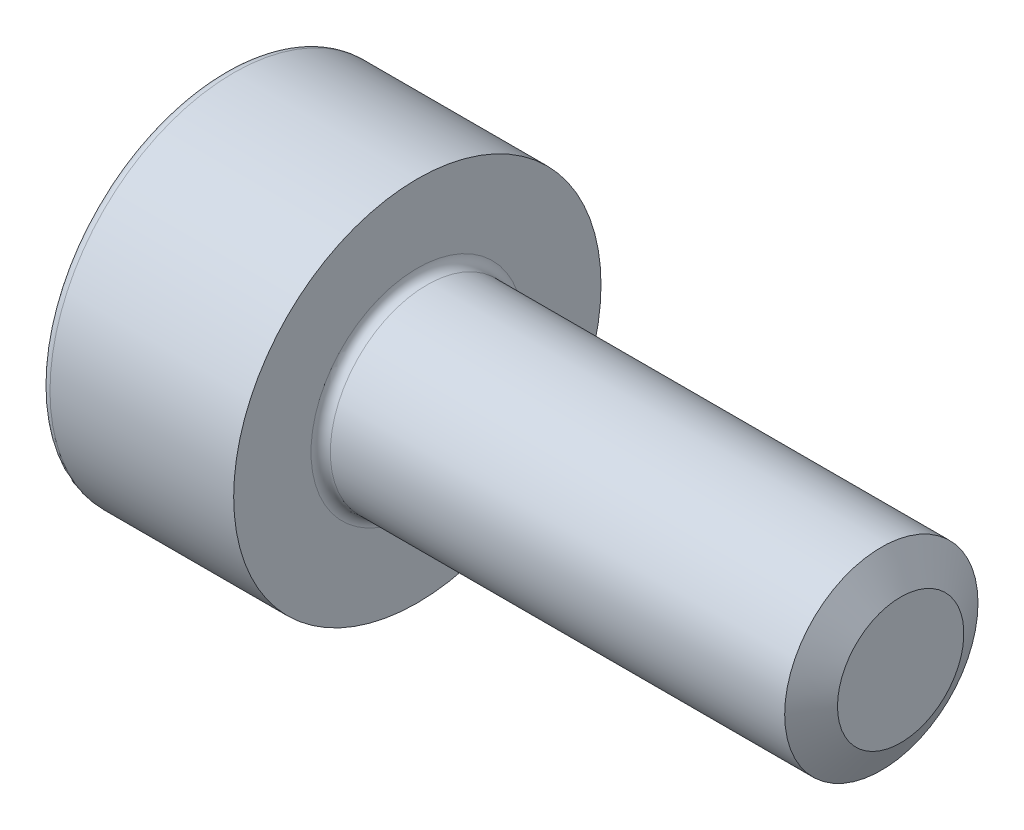
ISO-10303-21;
HEADER;
FILE_DESCRIPTION(('STEP AP214'),'2;1');
FILE_NAME('part.step','',(''),(''),'','','');
FILE_SCHEMA(('AUTOMOTIVE_DESIGN { 1 0 10303 214 1 1 1 1 }'));
ENDSEC;
DATA;
#1=APPLICATION_CONTEXT('core data for automotive mechanical design processes');
#2=APPLICATION_PROTOCOL_DEFINITION('international standard','automotive_design',2000,#1);
#3=PRODUCT_CONTEXT('',#1,'mechanical');
#4=PRODUCT('Part','Part','',(#3));
#5=PRODUCT_RELATED_PRODUCT_CATEGORY('part','',(#4));
#6=PRODUCT_DEFINITION_FORMATION('','',#4);
#7=PRODUCT_DEFINITION_CONTEXT('part definition',#1,'design');
#8=PRODUCT_DEFINITION('design','',#6,#7);
#9=PRODUCT_DEFINITION_SHAPE('','',#8);
#10=(LENGTH_UNIT() NAMED_UNIT(*) SI_UNIT(.MILLI.,.METRE.));
#11=(NAMED_UNIT(*) PLANE_ANGLE_UNIT() SI_UNIT($,.RADIAN.));
#12=(NAMED_UNIT(*) SI_UNIT($,.STERADIAN.) SOLID_ANGLE_UNIT());
#13=UNCERTAINTY_MEASURE_WITH_UNIT(LENGTH_MEASURE(1.E-05),#10,'distance_accuracy_value','');
#14=(GEOMETRIC_REPRESENTATION_CONTEXT(3) GLOBAL_UNCERTAINTY_ASSIGNED_CONTEXT((#13)) GLOBAL_UNIT_ASSIGNED_CONTEXT((#10,
#11,#12)) REPRESENTATION_CONTEXT('',''));
#15=CARTESIAN_POINT('',(0.,0.,0.));
#16=DIRECTION('',(0.,0.,1.));
#17=DIRECTION('',(1.,0.,0.));
#18=AXIS2_PLACEMENT_3D('',#15,#16,#17);
#19=CARTESIAN_POINT('',(0.,0.,0.));
#20=DIRECTION('',(1.,0.,0.));
#21=DIRECTION('',(0.,0.,-1.));
#22=AXIS2_PLACEMENT_3D('',#19,#20,#21);
#23=CYLINDRICAL_SURFACE('',#22,1.);
#24=CARTESIAN_POINT('',(2.1,0.,0.));
#25=DIRECTION('',(1.,0.,0.));
#26=DIRECTION('',(0.,0.,-1.));
#27=AXIS2_PLACEMENT_3D('',#24,#25,#26);
#28=CIRCLE('',#27,1.);
#29=CARTESIAN_POINT('',(2.1,0.,-1.));
#30=VERTEX_POINT('',#29);
#31=EDGE_CURVE('E145',#30,#30,#28,.T.);
#32=ORIENTED_EDGE('',*,*,#31,.T.);
#33=EDGE_LOOP('',(#32));
#34=FACE_BOUND('',#33,.T.);
#35=CARTESIAN_POINT('',(6.8,0.,0.));
#36=DIRECTION('',(-1.,0.,0.));
#37=DIRECTION('',(0.,0.,1.));
#38=AXIS2_PLACEMENT_3D('',#35,#36,#37);
#39=CIRCLE('',#38,1.);
#40=CARTESIAN_POINT('',(6.8,0.,1.));
#41=VERTEX_POINT('',#40);
#42=EDGE_CURVE('E315',#41,#41,#39,.T.);
#43=ORIENTED_EDGE('',*,*,#42,.T.);
#44=EDGE_LOOP('',(#43));
#45=FACE_BOUND('',#44,.T.);
#46=ADVANCED_FACE('F42',(#34,#45),#23,.T.);
#47=CARTESIAN_POINT('',(0.,0.,0.));
#48=DIRECTION('',(-1.,0.,0.));
#49=DIRECTION('',(0.,0.,1.));
#50=AXIS2_PLACEMENT_3D('',#47,#48,#49);
#51=PLANE('',#50);
#52=CARTESIAN_POINT('',(0.,0.,0.));
#53=DIRECTION('',(-1.,0.,0.));
#54=DIRECTION('',(0.,0.,1.));
#55=AXIS2_PLACEMENT_3D('',#52,#53,#54);
#56=CIRCLE('',#55,1.8);
#57=CARTESIAN_POINT('',(0.,0.,1.8));
#58=VERTEX_POINT('',#57);
#59=EDGE_CURVE('E11',#58,#58,#56,.T.);
#60=ORIENTED_EDGE('',*,*,#59,.T.);
#61=EDGE_LOOP('',(#60));
#62=FACE_BOUND('',#61,.T.);
#63=DIRECTION('',(0.,0.5,0.866025403784439));
#64=VECTOR('',#63,1.);
#65=CARTESIAN_POINT('',(0.,-0.865,0.));
#66=LINE('',#65,#64);
#67=CARTESIAN_POINT('',(0.,-0.865,0.));
#68=VERTEX_POINT('',#67);
#69=CARTESIAN_POINT('',(0.,-0.432500000000001,0.749111974273539));
#70=VERTEX_POINT('',#69);
#71=EDGE_CURVE('E57',#68,#70,#66,.T.);
#72=ORIENTED_EDGE('',*,*,#71,.F.);
#73=DIRECTION('',(0.,-0.5,0.866025403784439));
#74=VECTOR('',#73,1.);
#75=CARTESIAN_POINT('',(0.,-0.432500000000001,-0.74911197427354));
#76=LINE('',#75,#74);
#77=CARTESIAN_POINT('',(0.,-0.432500000000001,-0.74911197427354));
#78=VERTEX_POINT('',#77);
#79=EDGE_CURVE('E141',#78,#68,#76,.T.);
#80=ORIENTED_EDGE('',*,*,#79,.F.);
#81=DIRECTION('',(0.,-1.,0.));
#82=VECTOR('',#81,1.);
#83=CARTESIAN_POINT('',(0.,0.4325,-0.74911197427354));
#84=LINE('',#83,#82);
#85=CARTESIAN_POINT('',(0.,0.4325,-0.74911197427354));
#86=VERTEX_POINT('',#85);
#87=EDGE_CURVE('E139',#86,#78,#84,.T.);
#88=ORIENTED_EDGE('',*,*,#87,.F.);
#89=DIRECTION('',(0.,-0.499999999999999,-0.866025403784439));
#90=VECTOR('',#89,1.);
#91=CARTESIAN_POINT('',(0.,0.864999999999999,0.));
#92=LINE('',#91,#90);
#93=CARTESIAN_POINT('',(0.,0.864999999999999,0.));
#94=VERTEX_POINT('',#93);
#95=EDGE_CURVE('E105',#94,#86,#92,.T.);
#96=ORIENTED_EDGE('',*,*,#95,.F.);
#97=DIRECTION('',(0.,0.5,-0.866025403784439));
#98=VECTOR('',#97,1.);
#99=CARTESIAN_POINT('',(0.,0.432499999999999,0.749111974273539));
#100=LINE('',#99,#98);
#101=CARTESIAN_POINT('',(0.,0.432499999999999,0.749111974273539));
#102=VERTEX_POINT('',#101);
#103=EDGE_CURVE('E135',#102,#94,#100,.T.);
#104=ORIENTED_EDGE('',*,*,#103,.F.);
#105=DIRECTION('',(0.,1.,0.));
#106=VECTOR('',#105,1.);
#107=CARTESIAN_POINT('',(0.,-0.432500000000001,0.749111974273539));
#108=LINE('',#107,#106);
#109=EDGE_CURVE('E131',#70,#102,#108,.T.);
#110=ORIENTED_EDGE('',*,*,#109,.F.);
#111=EDGE_LOOP('',(#72,#80,#88,#96,#104,#110));
#112=FACE_BOUND('',#111,.T.);
#113=ADVANCED_FACE('F179',(#62,#112),#51,.T.);
#114=CARTESIAN_POINT('',(0.,0.,0.));
#115=DIRECTION('',(1.,0.,0.));
#116=DIRECTION('',(0.,0.,-1.));
#117=AXIS2_PLACEMENT_3D('',#114,#115,#116);
#118=CYLINDRICAL_SURFACE('',#117,1.9);
#119=CARTESIAN_POINT('',(0.1,0.,0.));
#120=DIRECTION('',(-1.,0.,0.));
#121=DIRECTION('',(0.,0.,1.));
#122=AXIS2_PLACEMENT_3D('',#119,#120,#121);
#123=CIRCLE('',#122,1.9);
#124=CARTESIAN_POINT('',(0.1,0.,1.9));
#125=VERTEX_POINT('',#124);
#126=EDGE_CURVE('E50',#125,#125,#123,.F.);
#127=ORIENTED_EDGE('',*,*,#126,.T.);
#128=EDGE_LOOP('',(#127));
#129=FACE_BOUND('',#128,.T.);
#130=CARTESIAN_POINT('',(2.,0.,0.));
#131=DIRECTION('',(1.,0.,0.));
#132=DIRECTION('',(0.,0.,-1.));
#133=AXIS2_PLACEMENT_3D('',#130,#131,#132);
#134=CIRCLE('',#133,1.9);
#135=CARTESIAN_POINT('',(2.,0.,-1.9));
#136=VERTEX_POINT('',#135);
#137=EDGE_CURVE('E156',#136,#136,#134,.T.);
#138=ORIENTED_EDGE('',*,*,#137,.F.);
#139=EDGE_LOOP('',(#138));
#140=FACE_BOUND('',#139,.T.);
#141=ADVANCED_FACE('F162',(#129,#140),#118,.T.);
#142=CARTESIAN_POINT('',(2.,1.9,0.));
#143=DIRECTION('',(1.,0.,0.));
#144=DIRECTION('',(0.,0.,-1.));
#145=AXIS2_PLACEMENT_3D('',#142,#143,#144);
#146=PLANE('',#145);
#147=ORIENTED_EDGE('',*,*,#137,.T.);
#148=EDGE_LOOP('',(#147));
#149=FACE_BOUND('',#148,.T.);
#150=CARTESIAN_POINT('',(2.,0.,0.));
#151=DIRECTION('',(1.,0.,0.));
#152=DIRECTION('',(0.,0.,-1.));
#153=AXIS2_PLACEMENT_3D('',#150,#151,#152);
#154=CIRCLE('',#153,1.1);
#155=CARTESIAN_POINT('',(2.,0.,-1.1));
#156=VERTEX_POINT('',#155);
#157=EDGE_CURVE('E153',#156,#156,#154,.T.);
#158=ORIENTED_EDGE('',*,*,#157,.F.);
#159=EDGE_LOOP('',(#158));
#160=FACE_BOUND('',#159,.T.);
#161=ADVANCED_FACE('F194',(#149,#160),#146,.T.);
#162=CARTESIAN_POINT('',(2.1,0.,0.));
#163=DIRECTION('',(1.,0.,0.));
#164=DIRECTION('',(0.,0.,-1.));
#165=AXIS2_PLACEMENT_3D('',#162,#163,#164);
#166=TOROIDAL_SURFACE('',#165,1.1,0.1);
#167=ORIENTED_EDGE('',*,*,#157,.T.);
#168=EDGE_LOOP('',(#167));
#169=FACE_BOUND('',#168,.T.);
#170=ORIENTED_EDGE('',*,*,#31,.F.);
#171=EDGE_LOOP('',(#170));
#172=FACE_BOUND('',#171,.T.);
#173=ADVANCED_FACE('F190',(#169,#172),#166,.F.);
#174=CARTESIAN_POINT('',(1.,-0.865,0.));
#175=DIRECTION('',(0.,-0.866025403784439,0.5));
#176=DIRECTION('',(0.,-0.5,-0.866025403784439));
#177=AXIS2_PLACEMENT_3D('',#174,#175,#176);
#178=PLANE('',#177);
#179=ORIENTED_EDGE('',*,*,#71,.T.);
#180=DIRECTION('',(-1.,0.,0.));
#181=VECTOR('',#180,1.);
#182=CARTESIAN_POINT('',(1.,-0.432500000000001,0.749111974273539));
#183=LINE('',#182,#181);
#184=CARTESIAN_POINT('',(1.,-0.432500000000001,0.749111974273539));
#185=VERTEX_POINT('',#184);
#186=EDGE_CURVE('E87',#185,#70,#183,.T.);
#187=ORIENTED_EDGE('',*,*,#186,.F.);
#188=DIRECTION('',(0.,0.5,0.866025403784439));
#189=VECTOR('',#188,1.);
#190=CARTESIAN_POINT('',(1.,-0.865,0.));
#191=LINE('',#190,#189);
#192=CARTESIAN_POINT('',(1.,-0.865,0.));
#193=VERTEX_POINT('',#192);
#194=EDGE_CURVE('E143',#193,#185,#191,.T.);
#195=ORIENTED_EDGE('',*,*,#194,.F.);
#196=DIRECTION('',(-1.,0.,0.));
#197=VECTOR('',#196,1.);
#198=CARTESIAN_POINT('',(1.,-0.865,0.));
#199=LINE('',#198,#197);
#200=EDGE_CURVE('E65',#193,#68,#199,.T.);
#201=ORIENTED_EDGE('',*,*,#200,.T.);
#202=EDGE_LOOP('',(#179,#187,#195,#201));
#203=FACE_BOUND('',#202,.T.);
#204=ADVANCED_FACE('F193',(#203),#178,.F.);
#205=CARTESIAN_POINT('',(1.,-0.432500000000001,-0.74911197427354));
#206=DIRECTION('',(0.,-0.866025403784439,-0.5));
#207=DIRECTION('',(0.,0.5,-0.866025403784439));
#208=AXIS2_PLACEMENT_3D('',#205,#206,#207);
#209=PLANE('',#208);
#210=ORIENTED_EDGE('',*,*,#79,.T.);
#211=ORIENTED_EDGE('',*,*,#200,.F.);
#212=DIRECTION('',(0.,-0.5,0.866025403784439));
#213=VECTOR('',#212,1.);
#214=CARTESIAN_POINT('',(1.,-0.432500000000001,-0.74911197427354));
#215=LINE('',#214,#213);
#216=CARTESIAN_POINT('',(1.,-0.432500000000001,-0.74911197427354));
#217=VERTEX_POINT('',#216);
#218=EDGE_CURVE('E117',#217,#193,#215,.T.);
#219=ORIENTED_EDGE('',*,*,#218,.F.);
#220=DIRECTION('',(-1.,0.,0.));
#221=VECTOR('',#220,1.);
#222=CARTESIAN_POINT('',(1.,-0.432500000000001,-0.74911197427354));
#223=LINE('',#222,#221);
#224=EDGE_CURVE('E109',#217,#78,#223,.T.);
#225=ORIENTED_EDGE('',*,*,#224,.T.);
#226=EDGE_LOOP('',(#210,#211,#219,#225));
#227=FACE_BOUND('',#226,.T.);
#228=ADVANCED_FACE('F218',(#227),#209,.F.);
#229=CARTESIAN_POINT('',(1.,0.4325,-0.74911197427354));
#230=DIRECTION('',(0.,0.,-1.));
#231=DIRECTION('',(-1.,0.,0.));
#232=AXIS2_PLACEMENT_3D('',#229,#230,#231);
#233=PLANE('',#232);
#234=ORIENTED_EDGE('',*,*,#87,.T.);
#235=ORIENTED_EDGE('',*,*,#224,.F.);
#236=DIRECTION('',(0.,-1.,0.));
#237=VECTOR('',#236,1.);
#238=CARTESIAN_POINT('',(1.,0.4325,-0.74911197427354));
#239=LINE('',#238,#237);
#240=CARTESIAN_POINT('',(1.,0.4325,-0.74911197427354));
#241=VERTEX_POINT('',#240);
#242=EDGE_CURVE('E113',#241,#217,#239,.T.);
#243=ORIENTED_EDGE('',*,*,#242,.F.);
#244=DIRECTION('',(-1.,0.,0.));
#245=VECTOR('',#244,1.);
#246=CARTESIAN_POINT('',(1.,0.4325,-0.74911197427354));
#247=LINE('',#246,#245);
#248=EDGE_CURVE('E98',#241,#86,#247,.T.);
#249=ORIENTED_EDGE('',*,*,#248,.T.);
#250=EDGE_LOOP('',(#234,#235,#243,#249));
#251=FACE_BOUND('',#250,.T.);
#252=ADVANCED_FACE('F114',(#251),#233,.F.);
#253=CARTESIAN_POINT('',(1.,0.864999999999999,0.));
#254=DIRECTION('',(0.,0.866025403784439,-0.499999999999999));
#255=DIRECTION('',(0.,0.499999999999999,0.866025403784439));
#256=AXIS2_PLACEMENT_3D('',#253,#254,#255);
#257=PLANE('',#256);
#258=ORIENTED_EDGE('',*,*,#95,.T.);
#259=ORIENTED_EDGE('',*,*,#248,.F.);
#260=DIRECTION('',(0.,-0.499999999999999,-0.866025403784439));
#261=VECTOR('',#260,1.);
#262=CARTESIAN_POINT('',(1.,0.864999999999999,0.));
#263=LINE('',#262,#261);
#264=CARTESIAN_POINT('',(1.,0.864999999999999,0.));
#265=VERTEX_POINT('',#264);
#266=EDGE_CURVE('E102',#265,#241,#263,.T.);
#267=ORIENTED_EDGE('',*,*,#266,.F.);
#268=DIRECTION('',(-1.,0.,0.));
#269=VECTOR('',#268,1.);
#270=CARTESIAN_POINT('',(1.,0.864999999999999,0.));
#271=LINE('',#270,#269);
#272=EDGE_CURVE('E110',#265,#94,#271,.T.);
#273=ORIENTED_EDGE('',*,*,#272,.T.);
#274=EDGE_LOOP('',(#258,#259,#267,#273));
#275=FACE_BOUND('',#274,.T.);
#276=ADVANCED_FACE('F100',(#275),#257,.F.);
#277=CARTESIAN_POINT('',(1.,0.432499999999999,0.749111974273539));
#278=DIRECTION('',(0.,0.866025403784439,0.5));
#279=DIRECTION('',(0.,-0.5,0.866025403784439));
#280=AXIS2_PLACEMENT_3D('',#277,#278,#279);
#281=PLANE('',#280);
#282=ORIENTED_EDGE('',*,*,#103,.T.);
#283=ORIENTED_EDGE('',*,*,#272,.F.);
#284=DIRECTION('',(0.,0.5,-0.866025403784439));
#285=VECTOR('',#284,1.);
#286=CARTESIAN_POINT('',(1.,0.432499999999999,0.749111974273539));
#287=LINE('',#286,#285);
#288=CARTESIAN_POINT('',(1.,0.432499999999999,0.749111974273539));
#289=VERTEX_POINT('',#288);
#290=EDGE_CURVE('E123',#289,#265,#287,.T.);
#291=ORIENTED_EDGE('',*,*,#290,.F.);
#292=DIRECTION('',(-1.,0.,0.));
#293=VECTOR('',#292,1.);
#294=CARTESIAN_POINT('',(1.,0.432499999999999,0.749111974273539));
#295=LINE('',#294,#293);
#296=EDGE_CURVE('E148',#289,#102,#295,.T.);
#297=ORIENTED_EDGE('',*,*,#296,.T.);
#298=EDGE_LOOP('',(#282,#283,#291,#297));
#299=FACE_BOUND('',#298,.T.);
#300=ADVANCED_FACE('F236',(#299),#281,.F.);
#301=CARTESIAN_POINT('',(1.,-0.432500000000001,0.749111974273539));
#302=DIRECTION('',(0.,0.,1.));
#303=DIRECTION('',(1.,0.,0.));
#304=AXIS2_PLACEMENT_3D('',#301,#302,#303);
#305=PLANE('',#304);
#306=ORIENTED_EDGE('',*,*,#109,.T.);
#307=ORIENTED_EDGE('',*,*,#296,.F.);
#308=DIRECTION('',(0.,1.,0.));
#309=VECTOR('',#308,1.);
#310=CARTESIAN_POINT('',(1.,-0.432500000000001,0.749111974273539));
#311=LINE('',#310,#309);
#312=EDGE_CURVE('E125',#185,#289,#311,.T.);
#313=ORIENTED_EDGE('',*,*,#312,.F.);
#314=ORIENTED_EDGE('',*,*,#186,.T.);
#315=EDGE_LOOP('',(#306,#307,#313,#314));
#316=FACE_BOUND('',#315,.T.);
#317=ADVANCED_FACE('F175',(#316),#305,.F.);
#318=CARTESIAN_POINT('',(1.,-0.4325,0.749111974273539));
#319=DIRECTION('',(-1.,0.,0.));
#320=DIRECTION('',(0.,0.,1.));
#321=AXIS2_PLACEMENT_3D('',#318,#319,#320);
#322=PLANE('',#321);
#323=ORIENTED_EDGE('',*,*,#194,.T.);
#324=ORIENTED_EDGE('',*,*,#312,.T.);
#325=ORIENTED_EDGE('',*,*,#290,.T.);
#326=ORIENTED_EDGE('',*,*,#266,.T.);
#327=ORIENTED_EDGE('',*,*,#242,.T.);
#328=ORIENTED_EDGE('',*,*,#218,.T.);
#329=EDGE_LOOP('',(#323,#324,#325,#326,#327,#328));
#330=FACE_BOUND('',#329,.T.);
#331=ADVANCED_FACE('F120',(#330),#322,.T.);
#332=CARTESIAN_POINT('',(0.1,0.,0.));
#333=DIRECTION('',(-1.,0.,0.));
#334=DIRECTION('',(0.,0.,1.));
#335=AXIS2_PLACEMENT_3D('',#332,#333,#334);
#336=TOROIDAL_SURFACE('',#335,1.8,0.1);
#337=ORIENTED_EDGE('',*,*,#59,.F.);
#338=EDGE_LOOP('',(#337));
#339=FACE_BOUND('',#338,.T.);
#340=ORIENTED_EDGE('',*,*,#126,.F.);
#341=EDGE_LOOP('',(#340));
#342=FACE_BOUND('',#341,.T.);
#343=ADVANCED_FACE('F44',(#339,#342),#336,.T.);
#344=CARTESIAN_POINT('',(6.8,0.,0.));
#345=DIRECTION('',(-1.,0.,0.));
#346=DIRECTION('',(0.,0.,1.));
#347=AXIS2_PLACEMENT_3D('',#344,#345,#346);
#348=CONICAL_SURFACE('',#347,1.,1.04718484902493);
#349=CARTESIAN_POINT('',(7.,0.,0.));
#350=DIRECTION('',(-1.,0.,0.));
#351=DIRECTION('',(0.,0.,1.));
#352=AXIS2_PLACEMENT_3D('',#349,#350,#351);
#353=CIRCLE('',#352,0.6536);
#354=CARTESIAN_POINT('',(7.,0.,0.6536));
#355=VERTEX_POINT('',#354);
#356=EDGE_CURVE('E132',#355,#355,#353,.T.);
#357=ORIENTED_EDGE('',*,*,#356,.T.);
#358=EDGE_LOOP('',(#357));
#359=FACE_BOUND('',#358,.T.);
#360=ORIENTED_EDGE('',*,*,#42,.F.);
#361=EDGE_LOOP('',(#360));
#362=FACE_BOUND('',#361,.T.);
#363=ADVANCED_FACE('F166',(#359,#362),#348,.T.);
#364=CARTESIAN_POINT('',(7.,1.,0.));
#365=DIRECTION('',(1.,0.,0.));
#366=DIRECTION('',(0.,0.,-1.));
#367=AXIS2_PLACEMENT_3D('',#364,#365,#366);
#368=PLANE('',#367);
#369=ORIENTED_EDGE('',*,*,#356,.F.);
#370=EDGE_LOOP('',(#369));
#371=FACE_BOUND('',#370,.T.);
#372=ADVANCED_FACE('F172',(#371),#368,.T.);
#373=CLOSED_SHELL('',(#46,#113,#141,#161,#173,#204,#228,#252,#276,#300,#317,#331,#343,#363,#372));
#374=MANIFOLD_SOLID_BREP('B2',#373);
#375=ADVANCED_BREP_SHAPE_REPRESENTATION('',(#18,#374),#14);
#376=SHAPE_DEFINITION_REPRESENTATION(#9,#375);
ENDSEC;
END-ISO-10303-21;
